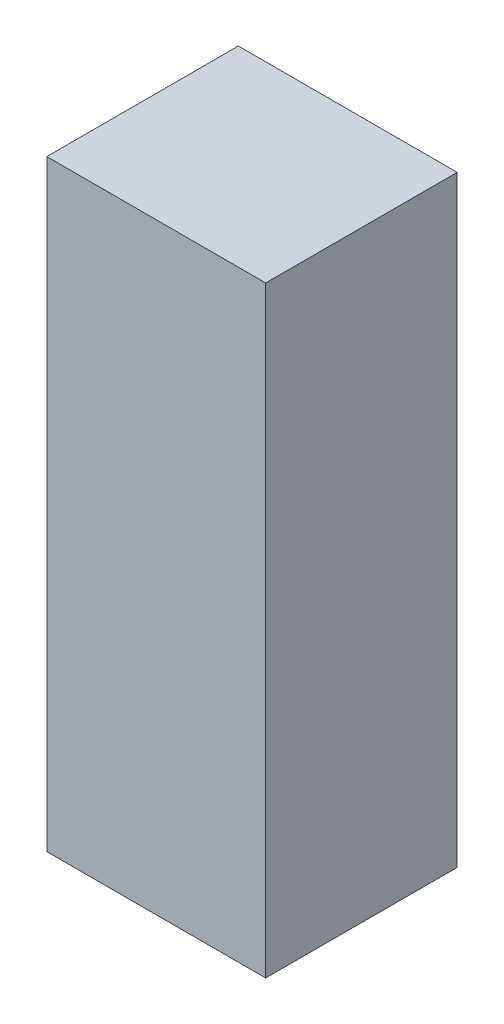
ISO-10303-21;
HEADER;
FILE_DESCRIPTION(('STEP AP214'),'2;1');
FILE_NAME('part.step','',(''),(''),'','','');
FILE_SCHEMA(('AUTOMOTIVE_DESIGN { 1 0 10303 214 1 1 1 1 }'));
ENDSEC;
DATA;
#1=APPLICATION_CONTEXT('core data for automotive mechanical design processes');
#2=APPLICATION_PROTOCOL_DEFINITION('international standard','automotive_design',2000,#1);
#3=PRODUCT_CONTEXT('',#1,'mechanical');
#4=PRODUCT('Part','Part','',(#3));
#5=PRODUCT_RELATED_PRODUCT_CATEGORY('part','',(#4));
#6=PRODUCT_DEFINITION_FORMATION('','',#4);
#7=PRODUCT_DEFINITION_CONTEXT('part definition',#1,'design');
#8=PRODUCT_DEFINITION('design','',#6,#7);
#9=PRODUCT_DEFINITION_SHAPE('','',#8);
#10=(LENGTH_UNIT() NAMED_UNIT(*) SI_UNIT(.MILLI.,.METRE.));
#11=(NAMED_UNIT(*) PLANE_ANGLE_UNIT() SI_UNIT($,.RADIAN.));
#12=(NAMED_UNIT(*) SI_UNIT($,.STERADIAN.) SOLID_ANGLE_UNIT());
#13=UNCERTAINTY_MEASURE_WITH_UNIT(LENGTH_MEASURE(1.E-05),#10,'distance_accuracy_value','');
#14=(GEOMETRIC_REPRESENTATION_CONTEXT(3) GLOBAL_UNCERTAINTY_ASSIGNED_CONTEXT((#13)) GLOBAL_UNIT_ASSIGNED_CONTEXT((#10,
#11,#12)) REPRESENTATION_CONTEXT('',''));
#15=CARTESIAN_POINT('',(0.,0.,0.));
#16=DIRECTION('',(0.,0.,1.));
#17=DIRECTION('',(1.,0.,0.));
#18=AXIS2_PLACEMENT_3D('',#15,#16,#17);
#19=CARTESIAN_POINT('',(20.,110.,17.5));
#20=DIRECTION('',(-1.,0.,0.));
#21=DIRECTION('',(0.,0.,1.));
#22=AXIS2_PLACEMENT_3D('',#19,#20,#21);
#23=PLANE('',#22);
#24=DIRECTION('',(0.,0.,-1.));
#25=VECTOR('',#24,1.);
#26=CARTESIAN_POINT('',(20.,0.,17.5));
#27=LINE('',#26,#25);
#28=CARTESIAN_POINT('',(20.,0.,17.5));
#29=VERTEX_POINT('',#28);
#30=CARTESIAN_POINT('',(20.,0.,-17.5));
#31=VERTEX_POINT('',#30);
#32=EDGE_CURVE('E113',#29,#31,#27,.T.);
#33=ORIENTED_EDGE('',*,*,#32,.T.);
#34=DIRECTION('',(0.,-1.,0.));
#35=VECTOR('',#34,1.);
#36=CARTESIAN_POINT('',(20.,110.,-17.5));
#37=LINE('',#36,#35);
#38=CARTESIAN_POINT('',(20.,110.,-17.5));
#39=VERTEX_POINT('',#38);
#40=EDGE_CURVE('E11',#39,#31,#37,.T.);
#41=ORIENTED_EDGE('',*,*,#40,.F.);
#42=DIRECTION('',(0.,0.,-1.));
#43=VECTOR('',#42,1.);
#44=CARTESIAN_POINT('',(20.,110.,17.5));
#45=LINE('',#44,#43);
#46=CARTESIAN_POINT('',(20.,110.,17.5));
#47=VERTEX_POINT('',#46);
#48=EDGE_CURVE('E97',#47,#39,#45,.T.);
#49=ORIENTED_EDGE('',*,*,#48,.F.);
#50=DIRECTION('',(0.,-1.,0.));
#51=VECTOR('',#50,1.);
#52=CARTESIAN_POINT('',(20.,110.,17.5));
#53=LINE('',#52,#51);
#54=EDGE_CURVE('E109',#47,#29,#53,.T.);
#55=ORIENTED_EDGE('',*,*,#54,.T.);
#56=EDGE_LOOP('',(#33,#41,#49,#55));
#57=FACE_BOUND('',#56,.T.);
#58=ADVANCED_FACE('F45',(#57),#23,.F.);
#59=CARTESIAN_POINT('',(-20.,110.,-17.5));
#60=DIRECTION('',(0.,0.,1.));
#61=DIRECTION('',(1.,0.,0.));
#62=AXIS2_PLACEMENT_3D('',#59,#60,#61);
#63=PLANE('',#62);
#64=DIRECTION('',(-1.,0.,0.));
#65=VECTOR('',#64,1.);
#66=CARTESIAN_POINT('',(-20.,0.,-17.5));
#67=LINE('',#66,#65);
#68=CARTESIAN_POINT('',(-20.,0.,-17.5));
#69=VERTEX_POINT('',#68);
#70=EDGE_CURVE('E102',#31,#69,#67,.T.);
#71=ORIENTED_EDGE('',*,*,#70,.T.);
#72=DIRECTION('',(0.,-1.,0.));
#73=VECTOR('',#72,1.);
#74=CARTESIAN_POINT('',(-20.,110.,-17.5));
#75=LINE('',#74,#73);
#76=CARTESIAN_POINT('',(-20.,110.,-17.5));
#77=VERTEX_POINT('',#76);
#78=EDGE_CURVE('E54',#77,#69,#75,.T.);
#79=ORIENTED_EDGE('',*,*,#78,.F.);
#80=DIRECTION('',(-1.,0.,0.));
#81=VECTOR('',#80,1.);
#82=CARTESIAN_POINT('',(-20.,110.,-17.5));
#83=LINE('',#82,#81);
#84=EDGE_CURVE('E92',#39,#77,#83,.T.);
#85=ORIENTED_EDGE('',*,*,#84,.F.);
#86=ORIENTED_EDGE('',*,*,#40,.T.);
#87=EDGE_LOOP('',(#71,#79,#85,#86));
#88=FACE_BOUND('',#87,.T.);
#89=ADVANCED_FACE('F101',(#88),#63,.F.);
#90=CARTESIAN_POINT('',(-20.,110.,17.5));
#91=DIRECTION('',(1.,0.,0.));
#92=DIRECTION('',(0.,0.,-1.));
#93=AXIS2_PLACEMENT_3D('',#90,#91,#92);
#94=PLANE('',#93);
#95=DIRECTION('',(0.,0.,1.));
#96=VECTOR('',#95,1.);
#97=CARTESIAN_POINT('',(-20.,0.,17.5));
#98=LINE('',#97,#96);
#99=CARTESIAN_POINT('',(-20.,0.,17.5));
#100=VERTEX_POINT('',#99);
#101=EDGE_CURVE('E79',#69,#100,#98,.T.);
#102=ORIENTED_EDGE('',*,*,#101,.T.);
#103=DIRECTION('',(0.,-1.,0.));
#104=VECTOR('',#103,1.);
#105=CARTESIAN_POINT('',(-20.,110.,17.5));
#106=LINE('',#105,#104);
#107=CARTESIAN_POINT('',(-20.,110.,17.5));
#108=VERTEX_POINT('',#107);
#109=EDGE_CURVE('E104',#108,#100,#106,.T.);
#110=ORIENTED_EDGE('',*,*,#109,.F.);
#111=DIRECTION('',(0.,0.,1.));
#112=VECTOR('',#111,1.);
#113=CARTESIAN_POINT('',(-20.,110.,17.5));
#114=LINE('',#113,#112);
#115=EDGE_CURVE('E95',#77,#108,#114,.T.);
#116=ORIENTED_EDGE('',*,*,#115,.F.);
#117=ORIENTED_EDGE('',*,*,#78,.T.);
#118=EDGE_LOOP('',(#102,#110,#116,#117));
#119=FACE_BOUND('',#118,.T.);
#120=ADVANCED_FACE('F105',(#119),#94,.F.);
#121=CARTESIAN_POINT('',(-20.,110.,17.5));
#122=DIRECTION('',(0.,0.,-1.));
#123=DIRECTION('',(-1.,0.,0.));
#124=AXIS2_PLACEMENT_3D('',#121,#122,#123);
#125=PLANE('',#124);
#126=DIRECTION('',(1.,0.,0.));
#127=VECTOR('',#126,1.);
#128=CARTESIAN_POINT('',(-20.,0.,17.5));
#129=LINE('',#128,#127);
#130=EDGE_CURVE('E85',#100,#29,#129,.T.);
#131=ORIENTED_EDGE('',*,*,#130,.T.);
#132=ORIENTED_EDGE('',*,*,#54,.F.);
#133=DIRECTION('',(1.,0.,0.));
#134=VECTOR('',#133,1.);
#135=CARTESIAN_POINT('',(-20.,110.,17.5));
#136=LINE('',#135,#134);
#137=EDGE_CURVE('E62',#108,#47,#136,.T.);
#138=ORIENTED_EDGE('',*,*,#137,.F.);
#139=ORIENTED_EDGE('',*,*,#109,.T.);
#140=EDGE_LOOP('',(#131,#132,#138,#139));
#141=FACE_BOUND('',#140,.T.);
#142=ADVANCED_FACE('F126',(#141),#125,.F.);
#143=CARTESIAN_POINT('',(0.,110.,0.));
#144=DIRECTION('',(0.,-1.,0.));
#145=DIRECTION('',(0.,0.,-1.));
#146=AXIS2_PLACEMENT_3D('',#143,#144,#145);
#147=PLANE('',#146);
#148=ORIENTED_EDGE('',*,*,#48,.T.);
#149=ORIENTED_EDGE('',*,*,#84,.T.);
#150=ORIENTED_EDGE('',*,*,#115,.T.);
#151=ORIENTED_EDGE('',*,*,#137,.T.);
#152=EDGE_LOOP('',(#148,#149,#150,#151));
#153=FACE_BOUND('',#152,.T.);
#154=ADVANCED_FACE('F93',(#153),#147,.F.);
#155=CARTESIAN_POINT('',(0.,0.,0.));
#156=DIRECTION('',(0.,-1.,0.));
#157=DIRECTION('',(0.,0.,-1.));
#158=AXIS2_PLACEMENT_3D('',#155,#156,#157);
#159=PLANE('',#158);
#160=ORIENTED_EDGE('',*,*,#32,.F.);
#161=ORIENTED_EDGE('',*,*,#130,.F.);
#162=ORIENTED_EDGE('',*,*,#101,.F.);
#163=ORIENTED_EDGE('',*,*,#70,.F.);
#164=EDGE_LOOP('',(#160,#161,#162,#163));
#165=FACE_BOUND('',#164,.T.);
#166=ADVANCED_FACE('F129',(#165),#159,.T.);
#167=CLOSED_SHELL('',(#58,#89,#120,#142,#154,#166));
#168=MANIFOLD_SOLID_BREP('B2',#167);
#169=ADVANCED_BREP_SHAPE_REPRESENTATION('',(#18,#168),#14);
#170=SHAPE_DEFINITION_REPRESENTATION(#9,#169);
ENDSEC;
END-ISO-10303-21;
